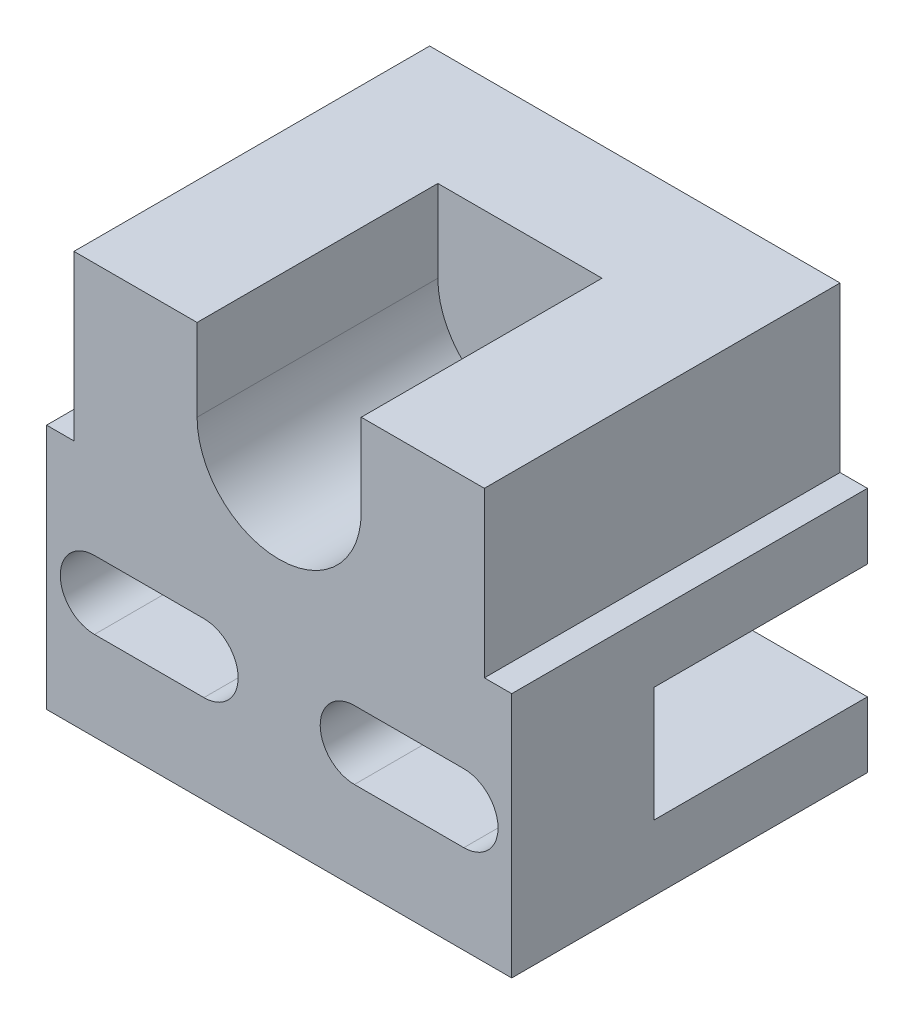
ISO-10303-21;
HEADER;
FILE_DESCRIPTION(('STEP AP214'),'2;1');
FILE_NAME('part.step','',(''),(''),'','','');
FILE_SCHEMA(('AUTOMOTIVE_DESIGN { 1 0 10303 214 1 1 1 1 }'));
ENDSEC;
DATA;
#1=APPLICATION_CONTEXT('core data for automotive mechanical design processes');
#2=APPLICATION_PROTOCOL_DEFINITION('international standard','automotive_design',2000,#1);
#3=PRODUCT_CONTEXT('',#1,'mechanical');
#4=PRODUCT('Part','Part','',(#3));
#5=PRODUCT_RELATED_PRODUCT_CATEGORY('part','',(#4));
#6=PRODUCT_DEFINITION_FORMATION('','',#4);
#7=PRODUCT_DEFINITION_CONTEXT('part definition',#1,'design');
#8=PRODUCT_DEFINITION('design','',#6,#7);
#9=PRODUCT_DEFINITION_SHAPE('','',#8);
#10=(LENGTH_UNIT() NAMED_UNIT(*) SI_UNIT(.MILLI.,.METRE.));
#11=(NAMED_UNIT(*) PLANE_ANGLE_UNIT() SI_UNIT($,.RADIAN.));
#12=(NAMED_UNIT(*) SI_UNIT($,.STERADIAN.) SOLID_ANGLE_UNIT());
#13=UNCERTAINTY_MEASURE_WITH_UNIT(LENGTH_MEASURE(1.E-05),#10,'distance_accuracy_value','');
#14=(GEOMETRIC_REPRESENTATION_CONTEXT(3) GLOBAL_UNCERTAINTY_ASSIGNED_CONTEXT((#13)) GLOBAL_UNIT_ASSIGNED_CONTEXT((#10,
#11,#12)) REPRESENTATION_CONTEXT('',''));
#15=CARTESIAN_POINT('',(0.,0.,0.));
#16=DIRECTION('',(0.,0.,1.));
#17=DIRECTION('',(1.,0.,0.));
#18=AXIS2_PLACEMENT_3D('',#15,#16,#17);
#19=CARTESIAN_POINT('',(0.,0.,0.));
#20=DIRECTION('',(0.,0.,1.));
#21=DIRECTION('',(1.,0.,0.));
#22=AXIS2_PLACEMENT_3D('',#19,#20,#21);
#23=PLANE('',#22);
#24=CARTESIAN_POINT('',(0.,8.26313972081442,0.));
#25=DIRECTION('',(0.,0.,1.));
#26=DIRECTION('',(1.,0.,0.));
#27=AXIS2_PLACEMENT_3D('',#24,#25,#26);
#28=CIRCLE('',#27,1.4);
#29=CARTESIAN_POINT('',(1.4,8.26313972081442,0.));
#30=VERTEX_POINT('',#29);
#31=EDGE_CURVE('E335',#30,#30,#28,.F.);
#32=ORIENTED_EDGE('',*,*,#31,.F.);
#33=EDGE_LOOP('',(#32));
#34=FACE_BOUND('',#33,.T.);
#35=CARTESIAN_POINT('',(0.,12.,0.));
#36=DIRECTION('',(0.,0.,1.));
#37=DIRECTION('',(1.,0.,0.));
#38=AXIS2_PLACEMENT_3D('',#35,#36,#37);
#39=CIRCLE('',#38,1.6);
#40=CARTESIAN_POINT('',(1.6,12.,0.));
#41=VERTEX_POINT('',#40);
#42=EDGE_CURVE('E535',#41,#41,#39,.T.);
#43=ORIENTED_EDGE('',*,*,#42,.T.);
#44=EDGE_LOOP('',(#43));
#45=FACE_BOUND('',#44,.T.);
#46=CARTESIAN_POINT('',(0.,2.26313972081442,0.));
#47=DIRECTION('',(0.,0.,-1.));
#48=DIRECTION('',(-1.,0.,0.));
#49=AXIS2_PLACEMENT_3D('',#46,#47,#48);
#50=CIRCLE('',#49,1.4);
#51=CARTESIAN_POINT('',(-1.21243556529821,2.96313972081442,0.));
#52=VERTEX_POINT('',#51);
#53=CARTESIAN_POINT('',(1.21243556529821,2.96313972081441,0.));
#54=VERTEX_POINT('',#53);
#55=EDGE_CURVE('E597',#52,#54,#50,.T.);
#56=ORIENTED_EDGE('',*,*,#55,.F.);
#57=DIRECTION('',(-0.5,-0.866025403784439,0.));
#58=VECTOR('',#57,1.);
#59=CARTESIAN_POINT('',(-0.325128869403573,4.5,0.));
#60=LINE('',#59,#58);
#61=CARTESIAN_POINT('',(-0.325128869403573,4.5,0.));
#62=VERTEX_POINT('',#61);
#63=EDGE_CURVE('E436',#62,#52,#60,.T.);
#64=ORIENTED_EDGE('',*,*,#63,.F.);
#65=DIRECTION('',(0.5,-0.866025403784439,0.));
#66=VECTOR('',#65,1.);
#67=CARTESIAN_POINT('',(-1.53756443470179,6.6,0.));
#68=LINE('',#67,#66);
#69=CARTESIAN_POINT('',(-1.53756443470179,6.6,0.));
#70=VERTEX_POINT('',#69);
#71=EDGE_CURVE('E439',#70,#62,#68,.T.);
#72=ORIENTED_EDGE('',*,*,#71,.F.);
#73=DIRECTION('',(1.,0.,0.));
#74=VECTOR('',#73,1.);
#75=CARTESIAN_POINT('',(-3.96243556529822,6.6,0.));
#76=LINE('',#75,#74);
#77=CARTESIAN_POINT('',(-8.5,6.6,0.));
#78=VERTEX_POINT('',#77);
#79=EDGE_CURVE('E432',#78,#70,#76,.T.);
#80=ORIENTED_EDGE('',*,*,#79,.F.);
#81=DIRECTION('',(0.,-1.,0.));
#82=VECTOR('',#81,1.);
#83=CARTESIAN_POINT('',(-8.5,0.,0.));
#84=LINE('',#83,#82);
#85=CARTESIAN_POINT('',(-8.5,9.,0.));
#86=VERTEX_POINT('',#85);
#87=EDGE_CURVE('E263',#86,#78,#84,.T.);
#88=ORIENTED_EDGE('',*,*,#87,.F.);
#89=DIRECTION('',(-1.,0.,0.));
#90=VECTOR('',#89,1.);
#91=CARTESIAN_POINT('',(-7.5,9.,0.));
#92=LINE('',#91,#90);
#93=CARTESIAN_POINT('',(-7.5,9.,0.));
#94=VERTEX_POINT('',#93);
#95=EDGE_CURVE('E273',#94,#86,#92,.T.);
#96=ORIENTED_EDGE('',*,*,#95,.F.);
#97=DIRECTION('',(0.,-1.,0.));
#98=VECTOR('',#97,1.);
#99=CARTESIAN_POINT('',(-7.5,15.,0.));
#100=LINE('',#99,#98);
#101=CARTESIAN_POINT('',(-7.5,15.,0.));
#102=VERTEX_POINT('',#101);
#103=EDGE_CURVE('E302',#102,#94,#100,.T.);
#104=ORIENTED_EDGE('',*,*,#103,.F.);
#105=DIRECTION('',(-1.,0.,0.));
#106=VECTOR('',#105,1.);
#107=CARTESIAN_POINT('',(-7.5,15.,0.));
#108=LINE('',#107,#106);
#109=CARTESIAN_POINT('',(7.5,15.,0.));
#110=VERTEX_POINT('',#109);
#111=EDGE_CURVE('E300',#110,#102,#108,.T.);
#112=ORIENTED_EDGE('',*,*,#111,.F.);
#113=DIRECTION('',(0.,1.,0.));
#114=VECTOR('',#113,1.);
#115=CARTESIAN_POINT('',(7.5,9.,0.));
#116=LINE('',#115,#114);
#117=CARTESIAN_POINT('',(7.5,9.,0.));
#118=VERTEX_POINT('',#117);
#119=EDGE_CURVE('E298',#118,#110,#116,.T.);
#120=ORIENTED_EDGE('',*,*,#119,.F.);
#121=DIRECTION('',(-1.,0.,0.));
#122=VECTOR('',#121,1.);
#123=CARTESIAN_POINT('',(8.5,9.,0.));
#124=LINE('',#123,#122);
#125=CARTESIAN_POINT('',(8.5,9.,0.));
#126=VERTEX_POINT('',#125);
#127=EDGE_CURVE('E296',#126,#118,#124,.T.);
#128=ORIENTED_EDGE('',*,*,#127,.F.);
#129=DIRECTION('',(0.,1.,0.));
#130=VECTOR('',#129,1.);
#131=CARTESIAN_POINT('',(8.5,0.,0.));
#132=LINE('',#131,#130);
#133=CARTESIAN_POINT('',(8.5,6.6,0.));
#134=VERTEX_POINT('',#133);
#135=EDGE_CURVE('E292',#134,#126,#132,.T.);
#136=ORIENTED_EDGE('',*,*,#135,.F.);
#137=DIRECTION('',(1.,0.,0.));
#138=VECTOR('',#137,1.);
#139=CARTESIAN_POINT('',(1.53756443470178,6.6,0.));
#140=LINE('',#139,#138);
#141=CARTESIAN_POINT('',(1.53756443470178,6.6,0.));
#142=VERTEX_POINT('',#141);
#143=EDGE_CURVE('E474',#142,#134,#140,.T.);
#144=ORIENTED_EDGE('',*,*,#143,.F.);
#145=DIRECTION('',(0.5,0.866025403784439,0.));
#146=VECTOR('',#145,1.);
#147=CARTESIAN_POINT('',(0.325128869403569,4.5,0.));
#148=LINE('',#147,#146);
#149=CARTESIAN_POINT('',(0.325128869403569,4.5,0.));
#150=VERTEX_POINT('',#149);
#151=EDGE_CURVE('E465',#150,#142,#148,.T.);
#152=ORIENTED_EDGE('',*,*,#151,.F.);
#153=DIRECTION('',(-0.5,0.866025403784439,0.));
#154=VECTOR('',#153,1.);
#155=CARTESIAN_POINT('',(1.53756443470178,2.4,0.));
#156=LINE('',#155,#154);
#157=EDGE_CURVE('E470',#54,#150,#156,.T.);
#158=ORIENTED_EDGE('',*,*,#157,.F.);
#159=EDGE_LOOP('',(#56,#64,#72,#80,#88,#96,#104,#112,#120,#128,#136,#144,#152,#158));
#160=FACE_BOUND('',#159,.T.);
#161=ADVANCED_FACE('F36',(#34,#45,#160),#23,.F.);
#162=EDGE_CURVE('E59',#54,#52,#50,.T.);
#163=ORIENTED_EDGE('',*,*,#162,.F.);
#164=CARTESIAN_POINT('',(1.53756443470178,2.4,0.));
#165=VERTEX_POINT('',#164);
#166=EDGE_CURVE('E466',#165,#54,#156,.T.);
#167=ORIENTED_EDGE('',*,*,#166,.F.);
#168=DIRECTION('',(-1.,0.,0.));
#169=VECTOR('',#168,1.);
#170=CARTESIAN_POINT('',(3.96243556529821,2.4,0.));
#171=LINE('',#170,#169);
#172=CARTESIAN_POINT('',(8.5,2.4,0.));
#173=VERTEX_POINT('',#172);
#174=EDGE_CURVE('E471',#173,#165,#171,.T.);
#175=ORIENTED_EDGE('',*,*,#174,.F.);
#176=CARTESIAN_POINT('',(8.5,0.,0.));
#177=VERTEX_POINT('',#176);
#178=EDGE_CURVE('E293',#177,#173,#132,.T.);
#179=ORIENTED_EDGE('',*,*,#178,.F.);
#180=DIRECTION('',(1.,0.,0.));
#181=VECTOR('',#180,1.);
#182=CARTESIAN_POINT('',(-8.5,0.,0.));
#183=LINE('',#182,#181);
#184=CARTESIAN_POINT('',(-8.5,0.,0.));
#185=VERTEX_POINT('',#184);
#186=EDGE_CURVE('E290',#185,#177,#183,.T.);
#187=ORIENTED_EDGE('',*,*,#186,.F.);
#188=CARTESIAN_POINT('',(-8.50000000000001,2.4,0.));
#189=VERTEX_POINT('',#188);
#190=EDGE_CURVE('E261',#189,#185,#84,.T.);
#191=ORIENTED_EDGE('',*,*,#190,.F.);
#192=DIRECTION('',(-1.,0.,0.));
#193=VECTOR('',#192,1.);
#194=CARTESIAN_POINT('',(-1.53756443470179,2.4,0.));
#195=LINE('',#194,#193);
#196=CARTESIAN_POINT('',(-1.53756443470179,2.4,0.));
#197=VERTEX_POINT('',#196);
#198=EDGE_CURVE('E433',#197,#189,#195,.T.);
#199=ORIENTED_EDGE('',*,*,#198,.F.);
#200=EDGE_CURVE('E438',#52,#197,#60,.T.);
#201=ORIENTED_EDGE('',*,*,#200,.F.);
#202=EDGE_LOOP('',(#163,#167,#175,#179,#187,#191,#199,#201));
#203=FACE_BOUND('',#202,.T.);
#204=ADVANCED_FACE('F362',(#203),#23,.F.);
#205=CARTESIAN_POINT('',(8.5,0.,13.));
#206=DIRECTION('',(-1.,0.,0.));
#207=DIRECTION('',(0.,-1.,0.));
#208=AXIS2_PLACEMENT_3D('',#205,#206,#207);
#209=PLANE('',#208);
#210=DIRECTION('',(0.,0.,1.));
#211=VECTOR('',#210,1.);
#212=CARTESIAN_POINT('',(8.5,2.4,-8.13114438445964));
#213=LINE('',#212,#211);
#214=CARTESIAN_POINT('',(8.5,2.4,7.8));
#215=VERTEX_POINT('',#214);
#216=EDGE_CURVE('E591',#173,#215,#213,.T.);
#217=ORIENTED_EDGE('',*,*,#216,.T.);
#218=DIRECTION('',(0.,-1.,0.));
#219=VECTOR('',#218,1.);
#220=CARTESIAN_POINT('',(8.5,6.6,7.8));
#221=LINE('',#220,#219);
#222=CARTESIAN_POINT('',(8.5,6.6,7.8));
#223=VERTEX_POINT('',#222);
#224=EDGE_CURVE('E589',#223,#215,#221,.T.);
#225=ORIENTED_EDGE('',*,*,#224,.F.);
#226=DIRECTION('',(0.,0.,1.));
#227=VECTOR('',#226,1.);
#228=CARTESIAN_POINT('',(8.5,6.6,-8.13114438445964));
#229=LINE('',#228,#227);
#230=EDGE_CURVE('E587',#134,#223,#229,.T.);
#231=ORIENTED_EDGE('',*,*,#230,.F.);
#232=ORIENTED_EDGE('',*,*,#135,.T.);
#233=DIRECTION('',(0.,0.,-1.));
#234=VECTOR('',#233,1.);
#235=CARTESIAN_POINT('',(8.5,9.,13.));
#236=LINE('',#235,#234);
#237=CARTESIAN_POINT('',(8.5,9.,13.));
#238=VERTEX_POINT('',#237);
#239=EDGE_CURVE('E319',#238,#126,#236,.T.);
#240=ORIENTED_EDGE('',*,*,#239,.F.);
#241=DIRECTION('',(0.,1.,0.));
#242=VECTOR('',#241,1.);
#243=CARTESIAN_POINT('',(8.5,0.,13.));
#244=LINE('',#243,#242);
#245=CARTESIAN_POINT('',(8.5,0.,13.));
#246=VERTEX_POINT('',#245);
#247=EDGE_CURVE('E275',#246,#238,#244,.T.);
#248=ORIENTED_EDGE('',*,*,#247,.F.);
#249=DIRECTION('',(0.,0.,-1.));
#250=VECTOR('',#249,1.);
#251=CARTESIAN_POINT('',(8.5,0.,13.));
#252=LINE('',#251,#250);
#253=EDGE_CURVE('E322',#246,#177,#252,.T.);
#254=ORIENTED_EDGE('',*,*,#253,.T.);
#255=ORIENTED_EDGE('',*,*,#178,.T.);
#256=EDGE_LOOP('',(#217,#225,#231,#232,#240,#248,#254,#255));
#257=FACE_BOUND('',#256,.T.);
#258=ADVANCED_FACE('F368',(#257),#209,.F.);
#259=CARTESIAN_POINT('',(-8.5,0.,13.));
#260=DIRECTION('',(1.,0.,0.));
#261=DIRECTION('',(0.,1.,0.));
#262=AXIS2_PLACEMENT_3D('',#259,#260,#261);
#263=PLANE('',#262);
#264=DIRECTION('',(0.,0.,1.));
#265=VECTOR('',#264,1.);
#266=CARTESIAN_POINT('',(-8.5,6.6,-8.13114438445964));
#267=LINE('',#266,#265);
#268=CARTESIAN_POINT('',(-8.5,6.6,7.8));
#269=VERTEX_POINT('',#268);
#270=EDGE_CURVE('E414',#78,#269,#267,.T.);
#271=ORIENTED_EDGE('',*,*,#270,.T.);
#272=DIRECTION('',(0.,1.,0.));
#273=VECTOR('',#272,1.);
#274=CARTESIAN_POINT('',(-8.5,6.6,7.8));
#275=LINE('',#274,#273);
#276=CARTESIAN_POINT('',(-8.50000000000001,2.4,7.8));
#277=VERTEX_POINT('',#276);
#278=EDGE_CURVE('E417',#277,#269,#275,.T.);
#279=ORIENTED_EDGE('',*,*,#278,.F.);
#280=DIRECTION('',(0.,0.,1.));
#281=VECTOR('',#280,1.);
#282=CARTESIAN_POINT('',(-8.50000000000001,2.4,-8.13114438445964));
#283=LINE('',#282,#281);
#284=EDGE_CURVE('E421',#189,#277,#283,.T.);
#285=ORIENTED_EDGE('',*,*,#284,.F.);
#286=ORIENTED_EDGE('',*,*,#190,.T.);
#287=DIRECTION('',(0.,0.,-1.));
#288=VECTOR('',#287,1.);
#289=CARTESIAN_POINT('',(-8.5,0.,13.));
#290=LINE('',#289,#288);
#291=CARTESIAN_POINT('',(-8.5,0.,13.));
#292=VERTEX_POINT('',#291);
#293=EDGE_CURVE('E325',#292,#185,#290,.T.);
#294=ORIENTED_EDGE('',*,*,#293,.F.);
#295=DIRECTION('',(0.,-1.,0.));
#296=VECTOR('',#295,1.);
#297=CARTESIAN_POINT('',(-8.5,0.,13.));
#298=LINE('',#297,#296);
#299=CARTESIAN_POINT('',(-8.5,9.,13.));
#300=VERTEX_POINT('',#299);
#301=EDGE_CURVE('E269',#300,#292,#298,.T.);
#302=ORIENTED_EDGE('',*,*,#301,.F.);
#303=DIRECTION('',(0.,0.,-1.));
#304=VECTOR('',#303,1.);
#305=CARTESIAN_POINT('',(-8.5,9.,13.));
#306=LINE('',#305,#304);
#307=EDGE_CURVE('E287',#300,#86,#306,.T.);
#308=ORIENTED_EDGE('',*,*,#307,.T.);
#309=ORIENTED_EDGE('',*,*,#87,.T.);
#310=EDGE_LOOP('',(#271,#279,#285,#286,#294,#302,#308,#309));
#311=FACE_BOUND('',#310,.T.);
#312=ADVANCED_FACE('F396',(#311),#263,.F.);
#313=CARTESIAN_POINT('',(-6.75,5.75,0.));
#314=DIRECTION('',(0.,1.,0.));
#315=DIRECTION('',(-1.,0.,0.));
#316=AXIS2_PLACEMENT_3D('',#313,#314,#315);
#317=PLANE('',#316);
#318=DIRECTION('',(0.,0.,1.));
#319=VECTOR('',#318,1.);
#320=CARTESIAN_POINT('',(-6.75,5.75,0.));
#321=LINE('',#320,#319);
#322=CARTESIAN_POINT('',(-6.75,5.75,7.8));
#323=VERTEX_POINT('',#322);
#324=CARTESIAN_POINT('',(-6.75,5.75,13.));
#325=VERTEX_POINT('',#324);
#326=EDGE_CURVE('E533',#323,#325,#321,.T.);
#327=ORIENTED_EDGE('',*,*,#326,.F.);
#328=DIRECTION('',(1.,0.,0.));
#329=VECTOR('',#328,1.);
#330=CARTESIAN_POINT('',(-6.75,5.75,7.8));
#331=LINE('',#330,#329);
#332=CARTESIAN_POINT('',(-2.75,5.75,7.8));
#333=VERTEX_POINT('',#332);
#334=EDGE_CURVE('E462',#323,#333,#331,.T.);
#335=ORIENTED_EDGE('',*,*,#334,.T.);
#336=DIRECTION('',(0.,0.,1.));
#337=VECTOR('',#336,1.);
#338=CARTESIAN_POINT('',(-2.75,5.75,0.));
#339=LINE('',#338,#337);
#340=CARTESIAN_POINT('',(-2.75,5.75,13.));
#341=VERTEX_POINT('',#340);
#342=EDGE_CURVE('E536',#333,#341,#339,.T.);
#343=ORIENTED_EDGE('',*,*,#342,.T.);
#344=DIRECTION('',(-1.,0.,0.));
#345=VECTOR('',#344,1.);
#346=CARTESIAN_POINT('',(-6.75,5.75,13.));
#347=LINE('',#346,#345);
#348=EDGE_CURVE('E529',#341,#325,#347,.T.);
#349=ORIENTED_EDGE('',*,*,#348,.T.);
#350=EDGE_LOOP('',(#327,#335,#343,#349));
#351=FACE_BOUND('',#350,.T.);
#352=ADVANCED_FACE('F403',(#351),#317,.F.);
#353=CARTESIAN_POINT('',(-6.75,3.25,0.));
#354=DIRECTION('',(0.,-1.,0.));
#355=DIRECTION('',(1.,0.,0.));
#356=AXIS2_PLACEMENT_3D('',#353,#354,#355);
#357=PLANE('',#356);
#358=DIRECTION('',(-1.,0.,0.));
#359=VECTOR('',#358,1.);
#360=CARTESIAN_POINT('',(-6.75,3.25,7.8));
#361=LINE('',#360,#359);
#362=CARTESIAN_POINT('',(-2.75,3.25,7.8));
#363=VERTEX_POINT('',#362);
#364=CARTESIAN_POINT('',(-6.75,3.25,7.8));
#365=VERTEX_POINT('',#364);
#366=EDGE_CURVE('E460',#363,#365,#361,.T.);
#367=ORIENTED_EDGE('',*,*,#366,.T.);
#368=DIRECTION('',(0.,0.,1.));
#369=VECTOR('',#368,1.);
#370=CARTESIAN_POINT('',(-6.75,3.25,0.));
#371=LINE('',#370,#369);
#372=CARTESIAN_POINT('',(-6.75,3.25,13.));
#373=VERTEX_POINT('',#372);
#374=EDGE_CURVE('E532',#365,#373,#371,.T.);
#375=ORIENTED_EDGE('',*,*,#374,.T.);
#376=DIRECTION('',(1.,0.,0.));
#377=VECTOR('',#376,1.);
#378=CARTESIAN_POINT('',(-6.75,3.25,13.));
#379=LINE('',#378,#377);
#380=CARTESIAN_POINT('',(-2.75,3.25,13.));
#381=VERTEX_POINT('',#380);
#382=EDGE_CURVE('E523',#373,#381,#379,.T.);
#383=ORIENTED_EDGE('',*,*,#382,.T.);
#384=DIRECTION('',(0.,0.,1.));
#385=VECTOR('',#384,1.);
#386=CARTESIAN_POINT('',(-2.75,3.25,0.));
#387=LINE('',#386,#385);
#388=EDGE_CURVE('E538',#363,#381,#387,.T.);
#389=ORIENTED_EDGE('',*,*,#388,.F.);
#390=EDGE_LOOP('',(#367,#375,#383,#389));
#391=FACE_BOUND('',#390,.T.);
#392=ADVANCED_FACE('F408',(#391),#357,.F.);
#393=CARTESIAN_POINT('',(-6.75,4.5,0.));
#394=DIRECTION('',(0.,0.,1.));
#395=DIRECTION('',(1.,0.,0.));
#396=AXIS2_PLACEMENT_3D('',#393,#394,#395);
#397=CYLINDRICAL_SURFACE('',#396,1.25);
#398=CARTESIAN_POINT('',(-6.75,4.5,7.8));
#399=DIRECTION('',(0.,0.,-1.));
#400=DIRECTION('',(-1.,0.,0.));
#401=AXIS2_PLACEMENT_3D('',#398,#399,#400);
#402=CIRCLE('',#401,1.25);
#403=EDGE_CURVE('E424',#323,#365,#402,.F.);
#404=ORIENTED_EDGE('',*,*,#403,.F.);
#405=ORIENTED_EDGE('',*,*,#326,.T.);
#406=CARTESIAN_POINT('',(-6.75,4.5,13.));
#407=DIRECTION('',(0.,0.,1.));
#408=DIRECTION('',(1.,0.,0.));
#409=AXIS2_PLACEMENT_3D('',#406,#407,#408);
#410=CIRCLE('',#409,1.25);
#411=EDGE_CURVE('E515',#325,#373,#410,.T.);
#412=ORIENTED_EDGE('',*,*,#411,.T.);
#413=ORIENTED_EDGE('',*,*,#374,.F.);
#414=EDGE_LOOP('',(#404,#405,#412,#413));
#415=FACE_BOUND('',#414,.T.);
#416=ADVANCED_FACE('F400',(#415),#397,.F.);
#417=CARTESIAN_POINT('',(-8.5,0.,13.));
#418=DIRECTION('',(0.,1.,0.));
#419=DIRECTION('',(0.,0.,1.));
#420=AXIS2_PLACEMENT_3D('',#417,#418,#419);
#421=PLANE('',#420);
#422=ORIENTED_EDGE('',*,*,#186,.T.);
#423=ORIENTED_EDGE('',*,*,#253,.F.);
#424=DIRECTION('',(1.,0.,0.));
#425=VECTOR('',#424,1.);
#426=CARTESIAN_POINT('',(-8.5,0.,13.));
#427=LINE('',#426,#425);
#428=EDGE_CURVE('E272',#292,#246,#427,.T.);
#429=ORIENTED_EDGE('',*,*,#428,.F.);
#430=ORIENTED_EDGE('',*,*,#293,.T.);
#431=EDGE_LOOP('',(#422,#423,#429,#430));
#432=FACE_BOUND('',#431,.T.);
#433=ADVANCED_FACE('F392',(#432),#421,.F.);
#434=CARTESIAN_POINT('',(8.5,9.,13.));
#435=DIRECTION('',(0.,-1.,0.));
#436=DIRECTION('',(0.,0.,-1.));
#437=AXIS2_PLACEMENT_3D('',#434,#435,#436);
#438=PLANE('',#437);
#439=ORIENTED_EDGE('',*,*,#127,.T.);
#440=DIRECTION('',(0.,0.,-1.));
#441=VECTOR('',#440,1.);
#442=CARTESIAN_POINT('',(7.5,9.,13.));
#443=LINE('',#442,#441);
#444=CARTESIAN_POINT('',(7.5,9.,13.));
#445=VERTEX_POINT('',#444);
#446=EDGE_CURVE('E316',#445,#118,#443,.T.);
#447=ORIENTED_EDGE('',*,*,#446,.F.);
#448=DIRECTION('',(-1.,0.,0.));
#449=VECTOR('',#448,1.);
#450=CARTESIAN_POINT('',(8.5,9.,13.));
#451=LINE('',#450,#449);
#452=EDGE_CURVE('E277',#238,#445,#451,.T.);
#453=ORIENTED_EDGE('',*,*,#452,.F.);
#454=ORIENTED_EDGE('',*,*,#239,.T.);
#455=EDGE_LOOP('',(#439,#447,#453,#454));
#456=FACE_BOUND('',#455,.T.);
#457=ADVANCED_FACE('F388',(#456),#438,.F.);
#458=CARTESIAN_POINT('',(7.5,9.,13.));
#459=DIRECTION('',(-1.,0.,0.));
#460=DIRECTION('',(0.,-1.,0.));
#461=AXIS2_PLACEMENT_3D('',#458,#459,#460);
#462=PLANE('',#461);
#463=ORIENTED_EDGE('',*,*,#119,.T.);
#464=DIRECTION('',(0.,0.,-1.));
#465=VECTOR('',#464,1.);
#466=CARTESIAN_POINT('',(7.5,15.,13.));
#467=LINE('',#466,#465);
#468=CARTESIAN_POINT('',(7.5,15.,13.));
#469=VERTEX_POINT('',#468);
#470=EDGE_CURVE('E313',#469,#110,#467,.T.);
#471=ORIENTED_EDGE('',*,*,#470,.F.);
#472=DIRECTION('',(0.,1.,0.));
#473=VECTOR('',#472,1.);
#474=CARTESIAN_POINT('',(7.5,9.,13.));
#475=LINE('',#474,#473);
#476=EDGE_CURVE('E279',#445,#469,#475,.T.);
#477=ORIENTED_EDGE('',*,*,#476,.F.);
#478=ORIENTED_EDGE('',*,*,#446,.T.);
#479=EDGE_LOOP('',(#463,#471,#477,#478));
#480=FACE_BOUND('',#479,.T.);
#481=ADVANCED_FACE('F385',(#480),#462,.F.);
#482=CARTESIAN_POINT('',(-7.5,15.,13.));
#483=DIRECTION('',(0.,-1.,0.));
#484=DIRECTION('',(0.,0.,-1.));
#485=AXIS2_PLACEMENT_3D('',#482,#483,#484);
#486=PLANE('',#485);
#487=DIRECTION('',(-1.,0.,0.));
#488=VECTOR('',#487,1.);
#489=CARTESIAN_POINT('',(3.,15.,4.2));
#490=LINE('',#489,#488);
#491=CARTESIAN_POINT('',(3.,15.,4.2));
#492=VERTEX_POINT('',#491);
#493=CARTESIAN_POINT('',(-3.,15.,4.2));
#494=VERTEX_POINT('',#493);
#495=EDGE_CURVE('E240',#492,#494,#490,.T.);
#496=ORIENTED_EDGE('',*,*,#495,.F.);
#497=DIRECTION('',(0.,0.,1.));
#498=VECTOR('',#497,1.);
#499=CARTESIAN_POINT('',(3.,15.,13.));
#500=LINE('',#499,#498);
#501=CARTESIAN_POINT('',(3.,15.,13.));
#502=VERTEX_POINT('',#501);
#503=EDGE_CURVE('E245',#492,#502,#500,.T.);
#504=ORIENTED_EDGE('',*,*,#503,.T.);
#505=DIRECTION('',(-1.,0.,0.));
#506=VECTOR('',#505,1.);
#507=CARTESIAN_POINT('',(-7.5,15.,13.));
#508=LINE('',#507,#506);
#509=EDGE_CURVE('E282',#469,#502,#508,.T.);
#510=ORIENTED_EDGE('',*,*,#509,.F.);
#511=ORIENTED_EDGE('',*,*,#470,.T.);
#512=ORIENTED_EDGE('',*,*,#111,.T.);
#513=DIRECTION('',(0.,0.,-1.));
#514=VECTOR('',#513,1.);
#515=CARTESIAN_POINT('',(-7.5,15.,13.));
#516=LINE('',#515,#514);
#517=CARTESIAN_POINT('',(-7.5,15.,13.));
#518=VERTEX_POINT('',#517);
#519=EDGE_CURVE('E310',#518,#102,#516,.T.);
#520=ORIENTED_EDGE('',*,*,#519,.F.);
#521=CARTESIAN_POINT('',(-3.,15.,13.));
#522=VERTEX_POINT('',#521);
#523=EDGE_CURVE('E281',#522,#518,#508,.T.);
#524=ORIENTED_EDGE('',*,*,#523,.F.);
#525=DIRECTION('',(0.,0.,-1.));
#526=VECTOR('',#525,1.);
#527=CARTESIAN_POINT('',(-3.,15.,13.));
#528=LINE('',#527,#526);
#529=EDGE_CURVE('E248',#522,#494,#528,.T.);
#530=ORIENTED_EDGE('',*,*,#529,.T.);
#531=EDGE_LOOP('',(#496,#504,#510,#511,#512,#520,#524,#530));
#532=FACE_BOUND('',#531,.T.);
#533=ADVANCED_FACE('F242',(#532),#486,.F.);
#534=CARTESIAN_POINT('',(-7.5,15.,13.));
#535=DIRECTION('',(1.,0.,0.));
#536=DIRECTION('',(0.,1.,0.));
#537=AXIS2_PLACEMENT_3D('',#534,#535,#536);
#538=PLANE('',#537);
#539=ORIENTED_EDGE('',*,*,#103,.T.);
#540=DIRECTION('',(0.,0.,-1.));
#541=VECTOR('',#540,1.);
#542=CARTESIAN_POINT('',(-7.5,9.,13.));
#543=LINE('',#542,#541);
#544=CARTESIAN_POINT('',(-7.5,9.,13.));
#545=VERTEX_POINT('',#544);
#546=EDGE_CURVE('E307',#545,#94,#543,.T.);
#547=ORIENTED_EDGE('',*,*,#546,.F.);
#548=DIRECTION('',(0.,-1.,0.));
#549=VECTOR('',#548,1.);
#550=CARTESIAN_POINT('',(-7.5,15.,13.));
#551=LINE('',#550,#549);
#552=EDGE_CURVE('E284',#518,#545,#551,.T.);
#553=ORIENTED_EDGE('',*,*,#552,.F.);
#554=ORIENTED_EDGE('',*,*,#519,.T.);
#555=EDGE_LOOP('',(#539,#547,#553,#554));
#556=FACE_BOUND('',#555,.T.);
#557=ADVANCED_FACE('F378',(#556),#538,.F.);
#558=CARTESIAN_POINT('',(-7.5,9.,13.));
#559=DIRECTION('',(0.,-1.,0.));
#560=DIRECTION('',(0.,0.,-1.));
#561=AXIS2_PLACEMENT_3D('',#558,#559,#560);
#562=PLANE('',#561);
#563=ORIENTED_EDGE('',*,*,#95,.T.);
#564=ORIENTED_EDGE('',*,*,#307,.F.);
#565=DIRECTION('',(-1.,0.,0.));
#566=VECTOR('',#565,1.);
#567=CARTESIAN_POINT('',(-7.5,9.,13.));
#568=LINE('',#567,#566);
#569=EDGE_CURVE('E286',#545,#300,#568,.T.);
#570=ORIENTED_EDGE('',*,*,#569,.F.);
#571=ORIENTED_EDGE('',*,*,#546,.T.);
#572=EDGE_LOOP('',(#563,#564,#570,#571));
#573=FACE_BOUND('',#572,.T.);
#574=ADVANCED_FACE('F375',(#573),#562,.F.);
#575=CARTESIAN_POINT('',(0.,0.,13.));
#576=DIRECTION('',(0.,0.,1.));
#577=DIRECTION('',(1.,0.,0.));
#578=AXIS2_PLACEMENT_3D('',#575,#576,#577);
#579=PLANE('',#578);
#580=CARTESIAN_POINT('',(6.75,4.5,13.));
#581=DIRECTION('',(0.,0.,1.));
#582=DIRECTION('',(1.,0.,0.));
#583=AXIS2_PLACEMENT_3D('',#580,#581,#582);
#584=CIRCLE('',#583,1.25);
#585=CARTESIAN_POINT('',(6.75,3.25,13.));
#586=VERTEX_POINT('',#585);
#587=CARTESIAN_POINT('',(6.75,5.75,13.));
#588=VERTEX_POINT('',#587);
#589=EDGE_CURVE('E500',#586,#588,#584,.T.);
#590=ORIENTED_EDGE('',*,*,#589,.F.);
#591=DIRECTION('',(1.,0.,0.));
#592=VECTOR('',#591,1.);
#593=CARTESIAN_POINT('',(6.75,3.25,13.));
#594=LINE('',#593,#592);
#595=CARTESIAN_POINT('',(2.75,3.25,13.));
#596=VERTEX_POINT('',#595);
#597=EDGE_CURVE('E509',#596,#586,#594,.T.);
#598=ORIENTED_EDGE('',*,*,#597,.F.);
#599=CARTESIAN_POINT('',(2.75,4.5,13.));
#600=DIRECTION('',(0.,0.,1.));
#601=DIRECTION('',(1.,0.,0.));
#602=AXIS2_PLACEMENT_3D('',#599,#600,#601);
#603=CIRCLE('',#602,1.25);
#604=CARTESIAN_POINT('',(2.75,5.75,13.));
#605=VERTEX_POINT('',#604);
#606=EDGE_CURVE('E506',#605,#596,#603,.T.);
#607=ORIENTED_EDGE('',*,*,#606,.F.);
#608=DIRECTION('',(-1.,0.,0.));
#609=VECTOR('',#608,1.);
#610=CARTESIAN_POINT('',(6.75,5.75,13.));
#611=LINE('',#610,#609);
#612=EDGE_CURVE('E503',#588,#605,#611,.T.);
#613=ORIENTED_EDGE('',*,*,#612,.F.);
#614=EDGE_LOOP('',(#590,#598,#607,#613));
#615=FACE_BOUND('',#614,.T.);
#616=ORIENTED_EDGE('',*,*,#348,.F.);
#617=CARTESIAN_POINT('',(-2.75,4.5,13.));
#618=DIRECTION('',(0.,0.,1.));
#619=DIRECTION('',(1.,0.,0.));
#620=AXIS2_PLACEMENT_3D('',#617,#618,#619);
#621=CIRCLE('',#620,1.25);
#622=EDGE_CURVE('E526',#381,#341,#621,.T.);
#623=ORIENTED_EDGE('',*,*,#622,.F.);
#624=ORIENTED_EDGE('',*,*,#382,.F.);
#625=ORIENTED_EDGE('',*,*,#411,.F.);
#626=EDGE_LOOP('',(#616,#623,#624,#625));
#627=FACE_BOUND('',#626,.T.);
#628=DIRECTION('',(0.,1.,0.));
#629=VECTOR('',#628,1.);
#630=CARTESIAN_POINT('',(3.,18.,13.));
#631=LINE('',#630,#629);
#632=CARTESIAN_POINT('',(3.,12.,13.));
#633=VERTEX_POINT('',#632);
#634=EDGE_CURVE('E259',#633,#502,#631,.T.);
#635=ORIENTED_EDGE('',*,*,#634,.F.);
#636=CARTESIAN_POINT('',(0.,12.,13.));
#637=DIRECTION('',(0.,0.,1.));
#638=DIRECTION('',(1.,0.,0.));
#639=AXIS2_PLACEMENT_3D('',#636,#637,#638);
#640=CIRCLE('',#639,3.);
#641=CARTESIAN_POINT('',(-3.,12.,13.));
#642=VERTEX_POINT('',#641);
#643=EDGE_CURVE('E543',#642,#633,#640,.T.);
#644=ORIENTED_EDGE('',*,*,#643,.F.);
#645=DIRECTION('',(0.,-1.,0.));
#646=VECTOR('',#645,1.);
#647=CARTESIAN_POINT('',(-3.,0.,13.));
#648=LINE('',#647,#646);
#649=EDGE_CURVE('E328',#522,#642,#648,.T.);
#650=ORIENTED_EDGE('',*,*,#649,.F.);
#651=ORIENTED_EDGE('',*,*,#523,.T.);
#652=ORIENTED_EDGE('',*,*,#552,.T.);
#653=ORIENTED_EDGE('',*,*,#569,.T.);
#654=ORIENTED_EDGE('',*,*,#301,.T.);
#655=ORIENTED_EDGE('',*,*,#428,.T.);
#656=ORIENTED_EDGE('',*,*,#247,.T.);
#657=ORIENTED_EDGE('',*,*,#452,.T.);
#658=ORIENTED_EDGE('',*,*,#476,.T.);
#659=ORIENTED_EDGE('',*,*,#509,.T.);
#660=EDGE_LOOP('',(#635,#644,#650,#651,#652,#653,#654,#655,#656,#657,#658,#659));
#661=FACE_BOUND('',#660,.T.);
#662=ADVANCED_FACE('F373',(#615,#627,#661),#579,.T.);
#663=CARTESIAN_POINT('',(3.,18.,-13.4164078649987));
#664=DIRECTION('',(1.,0.,0.));
#665=DIRECTION('',(0.,1.,0.));
#666=AXIS2_PLACEMENT_3D('',#663,#664,#665);
#667=PLANE('',#666);
#668=ORIENTED_EDGE('',*,*,#503,.F.);
#669=DIRECTION('',(0.,1.,0.));
#670=VECTOR('',#669,1.);
#671=CARTESIAN_POINT('',(3.,12.,4.2));
#672=LINE('',#671,#670);
#673=CARTESIAN_POINT('',(3.,12.,4.2));
#674=VERTEX_POINT('',#673);
#675=EDGE_CURVE('E249',#674,#492,#672,.T.);
#676=ORIENTED_EDGE('',*,*,#675,.F.);
#677=DIRECTION('',(0.,0.,1.));
#678=VECTOR('',#677,1.);
#679=CARTESIAN_POINT('',(3.,12.,-13.4164078649987));
#680=LINE('',#679,#678);
#681=EDGE_CURVE('E265',#674,#633,#680,.T.);
#682=ORIENTED_EDGE('',*,*,#681,.T.);
#683=ORIENTED_EDGE('',*,*,#634,.T.);
#684=EDGE_LOOP('',(#668,#676,#682,#683));
#685=FACE_BOUND('',#684,.T.);
#686=ADVANCED_FACE('F257',(#685),#667,.F.);
#687=CARTESIAN_POINT('',(-3.,18.,-13.4164078649987));
#688=DIRECTION('',(-1.,0.,0.));
#689=DIRECTION('',(0.,-1.,0.));
#690=AXIS2_PLACEMENT_3D('',#687,#688,#689);
#691=PLANE('',#690);
#692=DIRECTION('',(0.,0.,1.));
#693=VECTOR('',#692,1.);
#694=CARTESIAN_POINT('',(-3.,12.,-13.4164078649987));
#695=LINE('',#694,#693);
#696=CARTESIAN_POINT('',(-3.,12.,4.2));
#697=VERTEX_POINT('',#696);
#698=EDGE_CURVE('E547',#697,#642,#695,.T.);
#699=ORIENTED_EDGE('',*,*,#698,.F.);
#700=DIRECTION('',(0.,-1.,0.));
#701=VECTOR('',#700,1.);
#702=CARTESIAN_POINT('',(-3.,15.,4.2));
#703=LINE('',#702,#701);
#704=EDGE_CURVE('E51',#494,#697,#703,.T.);
#705=ORIENTED_EDGE('',*,*,#704,.F.);
#706=ORIENTED_EDGE('',*,*,#529,.F.);
#707=ORIENTED_EDGE('',*,*,#649,.T.);
#708=EDGE_LOOP('',(#699,#705,#706,#707));
#709=FACE_BOUND('',#708,.T.);
#710=ADVANCED_FACE('F554',(#709),#691,.F.);
#711=CARTESIAN_POINT('',(0.,12.,-13.4164078649987));
#712=DIRECTION('',(0.,0.,1.));
#713=DIRECTION('',(1.,0.,0.));
#714=AXIS2_PLACEMENT_3D('',#711,#712,#713);
#715=CYLINDRICAL_SURFACE('',#714,3.);
#716=ORIENTED_EDGE('',*,*,#681,.F.);
#717=CARTESIAN_POINT('',(0.,12.,4.2));
#718=DIRECTION('',(0.,0.,1.));
#719=DIRECTION('',(1.,0.,0.));
#720=AXIS2_PLACEMENT_3D('',#717,#718,#719);
#721=CIRCLE('',#720,3.);
#722=EDGE_CURVE('E253',#697,#674,#721,.T.);
#723=ORIENTED_EDGE('',*,*,#722,.F.);
#724=ORIENTED_EDGE('',*,*,#698,.T.);
#725=ORIENTED_EDGE('',*,*,#643,.T.);
#726=EDGE_LOOP('',(#716,#723,#724,#725));
#727=FACE_BOUND('',#726,.T.);
#728=ADVANCED_FACE('F550',(#727),#715,.F.);
#729=CARTESIAN_POINT('',(0.,12.,0.));
#730=DIRECTION('',(0.,0.,1.));
#731=DIRECTION('',(1.,0.,0.));
#732=AXIS2_PLACEMENT_3D('',#729,#730,#731);
#733=CYLINDRICAL_SURFACE('',#732,1.6);
#734=ORIENTED_EDGE('',*,*,#42,.F.);
#735=EDGE_LOOP('',(#734));
#736=FACE_BOUND('',#735,.T.);
#737=CARTESIAN_POINT('',(0.,12.,4.));
#738=DIRECTION('',(0.,0.,1.));
#739=DIRECTION('',(1.,0.,0.));
#740=AXIS2_PLACEMENT_3D('',#737,#738,#739);
#741=CIRCLE('',#740,1.6);
#742=CARTESIAN_POINT('',(1.6,12.,4.));
#743=VERTEX_POINT('',#742);
#744=EDGE_CURVE('E600',#743,#743,#741,.F.);
#745=ORIENTED_EDGE('',*,*,#744,.F.);
#746=EDGE_LOOP('',(#745));
#747=FACE_BOUND('',#746,.T.);
#748=ADVANCED_FACE('F661',(#736,#747),#733,.F.);
#749=CARTESIAN_POINT('',(-2.75,4.5,0.));
#750=DIRECTION('',(0.,0.,1.));
#751=DIRECTION('',(1.,0.,0.));
#752=AXIS2_PLACEMENT_3D('',#749,#750,#751);
#753=CYLINDRICAL_SURFACE('',#752,1.25);
#754=ORIENTED_EDGE('',*,*,#342,.F.);
#755=CARTESIAN_POINT('',(-2.75,4.5,7.8));
#756=DIRECTION('',(0.,0.,1.));
#757=DIRECTION('',(1.,0.,0.));
#758=AXIS2_PLACEMENT_3D('',#755,#756,#757);
#759=CIRCLE('',#758,1.25);
#760=EDGE_CURVE('E333',#333,#363,#759,.F.);
#761=ORIENTED_EDGE('',*,*,#760,.T.);
#762=ORIENTED_EDGE('',*,*,#388,.T.);
#763=ORIENTED_EDGE('',*,*,#622,.T.);
#764=EDGE_LOOP('',(#754,#761,#762,#763));
#765=FACE_BOUND('',#764,.T.);
#766=ADVANCED_FACE('F647',(#765),#753,.F.);
#767=CARTESIAN_POINT('',(6.75,3.25,0.));
#768=DIRECTION('',(0.,-1.,0.));
#769=DIRECTION('',(1.,0.,0.));
#770=AXIS2_PLACEMENT_3D('',#767,#768,#769);
#771=PLANE('',#770);
#772=DIRECTION('',(0.,0.,1.));
#773=VECTOR('',#772,1.);
#774=CARTESIAN_POINT('',(6.75,3.25,0.));
#775=LINE('',#774,#773);
#776=CARTESIAN_POINT('',(6.75,3.25,7.8));
#777=VERTEX_POINT('',#776);
#778=EDGE_CURVE('E513',#777,#586,#775,.T.);
#779=ORIENTED_EDGE('',*,*,#778,.F.);
#780=DIRECTION('',(-1.,0.,0.));
#781=VECTOR('',#780,1.);
#782=CARTESIAN_POINT('',(6.75,3.25,7.8));
#783=LINE('',#782,#781);
#784=CARTESIAN_POINT('',(2.75,3.25,7.8));
#785=VERTEX_POINT('',#784);
#786=EDGE_CURVE('E497',#777,#785,#783,.T.);
#787=ORIENTED_EDGE('',*,*,#786,.T.);
#788=DIRECTION('',(0.,0.,1.));
#789=VECTOR('',#788,1.);
#790=CARTESIAN_POINT('',(2.75,3.25,0.));
#791=LINE('',#790,#789);
#792=EDGE_CURVE('E516',#785,#596,#791,.T.);
#793=ORIENTED_EDGE('',*,*,#792,.T.);
#794=ORIENTED_EDGE('',*,*,#597,.T.);
#795=EDGE_LOOP('',(#779,#787,#793,#794));
#796=FACE_BOUND('',#795,.T.);
#797=ADVANCED_FACE('F643',(#796),#771,.F.);
#798=CARTESIAN_POINT('',(6.75,5.75,0.));
#799=DIRECTION('',(0.,1.,0.));
#800=DIRECTION('',(-1.,0.,0.));
#801=AXIS2_PLACEMENT_3D('',#798,#799,#800);
#802=PLANE('',#801);
#803=DIRECTION('',(1.,0.,0.));
#804=VECTOR('',#803,1.);
#805=CARTESIAN_POINT('',(6.75,5.75,7.8));
#806=LINE('',#805,#804);
#807=CARTESIAN_POINT('',(2.75,5.75,7.8));
#808=VERTEX_POINT('',#807);
#809=CARTESIAN_POINT('',(6.75,5.75,7.8));
#810=VERTEX_POINT('',#809);
#811=EDGE_CURVE('E495',#808,#810,#806,.T.);
#812=ORIENTED_EDGE('',*,*,#811,.T.);
#813=DIRECTION('',(0.,0.,1.));
#814=VECTOR('',#813,1.);
#815=CARTESIAN_POINT('',(6.75,5.75,0.));
#816=LINE('',#815,#814);
#817=EDGE_CURVE('E512',#810,#588,#816,.T.);
#818=ORIENTED_EDGE('',*,*,#817,.T.);
#819=ORIENTED_EDGE('',*,*,#612,.T.);
#820=DIRECTION('',(0.,0.,1.));
#821=VECTOR('',#820,1.);
#822=CARTESIAN_POINT('',(2.75,5.75,0.));
#823=LINE('',#822,#821);
#824=EDGE_CURVE('E518',#808,#605,#823,.T.);
#825=ORIENTED_EDGE('',*,*,#824,.F.);
#826=EDGE_LOOP('',(#812,#818,#819,#825));
#827=FACE_BOUND('',#826,.T.);
#828=ADVANCED_FACE('F646',(#827),#802,.F.);
#829=CARTESIAN_POINT('',(6.75,4.5,0.));
#830=DIRECTION('',(0.,0.,1.));
#831=DIRECTION('',(1.,0.,0.));
#832=AXIS2_PLACEMENT_3D('',#829,#830,#831);
#833=CYLINDRICAL_SURFACE('',#832,1.25);
#834=ORIENTED_EDGE('',*,*,#817,.F.);
#835=CARTESIAN_POINT('',(6.75,4.5,7.8));
#836=DIRECTION('',(0.,0.,1.));
#837=DIRECTION('',(1.,0.,0.));
#838=AXIS2_PLACEMENT_3D('',#835,#836,#837);
#839=CIRCLE('',#838,1.25);
#840=EDGE_CURVE('E426',#810,#777,#839,.F.);
#841=ORIENTED_EDGE('',*,*,#840,.T.);
#842=ORIENTED_EDGE('',*,*,#778,.T.);
#843=ORIENTED_EDGE('',*,*,#589,.T.);
#844=EDGE_LOOP('',(#834,#841,#842,#843));
#845=FACE_BOUND('',#844,.T.);
#846=ADVANCED_FACE('F651',(#845),#833,.F.);
#847=CARTESIAN_POINT('',(2.75,4.5,0.));
#848=DIRECTION('',(0.,0.,1.));
#849=DIRECTION('',(1.,0.,0.));
#850=AXIS2_PLACEMENT_3D('',#847,#848,#849);
#851=CYLINDRICAL_SURFACE('',#850,1.25);
#852=ORIENTED_EDGE('',*,*,#792,.F.);
#853=CARTESIAN_POINT('',(2.75,4.5,7.8));
#854=DIRECTION('',(0.,0.,1.));
#855=DIRECTION('',(1.,0.,0.));
#856=AXIS2_PLACEMENT_3D('',#853,#854,#855);
#857=CIRCLE('',#856,1.25);
#858=EDGE_CURVE('E331',#785,#808,#857,.F.);
#859=ORIENTED_EDGE('',*,*,#858,.T.);
#860=ORIENTED_EDGE('',*,*,#824,.T.);
#861=ORIENTED_EDGE('',*,*,#606,.T.);
#862=EDGE_LOOP('',(#852,#859,#860,#861));
#863=FACE_BOUND('',#862,.T.);
#864=ADVANCED_FACE('F642',(#863),#851,.F.);
#865=CARTESIAN_POINT('',(0.,0.,7.8));
#866=DIRECTION('',(0.,0.,1.));
#867=DIRECTION('',(1.,0.,0.));
#868=AXIS2_PLACEMENT_3D('',#865,#866,#867);
#869=PLANE('',#868);
#870=ORIENTED_EDGE('',*,*,#224,.T.);
#871=DIRECTION('',(-1.,0.,0.));
#872=VECTOR('',#871,1.);
#873=CARTESIAN_POINT('',(3.96243556529821,2.4,7.8));
#874=LINE('',#873,#872);
#875=CARTESIAN_POINT('',(1.53756443470178,2.4,7.8));
#876=VERTEX_POINT('',#875);
#877=EDGE_CURVE('E479',#215,#876,#874,.T.);
#878=ORIENTED_EDGE('',*,*,#877,.T.);
#879=DIRECTION('',(-0.5,0.866025403784439,0.));
#880=VECTOR('',#879,1.);
#881=CARTESIAN_POINT('',(1.53756443470178,2.4,7.8));
#882=LINE('',#881,#880);
#883=CARTESIAN_POINT('',(0.325128869403569,4.5,7.8));
#884=VERTEX_POINT('',#883);
#885=EDGE_CURVE('E485',#876,#884,#882,.T.);
#886=ORIENTED_EDGE('',*,*,#885,.T.);
#887=DIRECTION('',(0.5,0.866025403784439,0.));
#888=VECTOR('',#887,1.);
#889=CARTESIAN_POINT('',(0.325128869403569,4.5,7.8));
#890=LINE('',#889,#888);
#891=CARTESIAN_POINT('',(1.53756443470178,6.6,7.8));
#892=VERTEX_POINT('',#891);
#893=EDGE_CURVE('E480',#884,#892,#890,.T.);
#894=ORIENTED_EDGE('',*,*,#893,.T.);
#895=DIRECTION('',(1.,0.,0.));
#896=VECTOR('',#895,1.);
#897=CARTESIAN_POINT('',(1.53756443470178,6.6,7.8));
#898=LINE('',#897,#896);
#899=EDGE_CURVE('E469',#892,#223,#898,.T.);
#900=ORIENTED_EDGE('',*,*,#899,.T.);
#901=EDGE_LOOP('',(#870,#878,#886,#894,#900));
#902=FACE_BOUND('',#901,.T.);
#903=ORIENTED_EDGE('',*,*,#811,.F.);
#904=ORIENTED_EDGE('',*,*,#858,.F.);
#905=ORIENTED_EDGE('',*,*,#786,.F.);
#906=ORIENTED_EDGE('',*,*,#840,.F.);
#907=EDGE_LOOP('',(#903,#904,#905,#906));
#908=FACE_BOUND('',#907,.T.);
#909=ADVANCED_FACE('F617',(#902,#908),#869,.F.);
#910=CARTESIAN_POINT('',(1.53756443470178,6.6,19.4156059729382));
#911=DIRECTION('',(0.,1.,0.));
#912=DIRECTION('',(0.,0.,1.));
#913=AXIS2_PLACEMENT_3D('',#910,#911,#912);
#914=PLANE('',#913);
#915=DIRECTION('',(0.,0.,-1.));
#916=VECTOR('',#915,1.);
#917=CARTESIAN_POINT('',(1.53756443470178,6.6,19.4156059729382));
#918=LINE('',#917,#916);
#919=EDGE_CURVE('E483',#892,#142,#918,.T.);
#920=ORIENTED_EDGE('',*,*,#919,.T.);
#921=ORIENTED_EDGE('',*,*,#143,.T.);
#922=ORIENTED_EDGE('',*,*,#230,.T.);
#923=ORIENTED_EDGE('',*,*,#899,.F.);
#924=EDGE_LOOP('',(#920,#921,#922,#923));
#925=FACE_BOUND('',#924,.T.);
#926=ADVANCED_FACE('F620',(#925),#914,.F.);
#927=CARTESIAN_POINT('',(3.96243556529821,2.4,19.4156059729382));
#928=DIRECTION('',(0.,-1.,0.));
#929=DIRECTION('',(1.,0.,0.));
#930=AXIS2_PLACEMENT_3D('',#927,#928,#929);
#931=PLANE('',#930);
#932=ORIENTED_EDGE('',*,*,#877,.F.);
#933=ORIENTED_EDGE('',*,*,#216,.F.);
#934=ORIENTED_EDGE('',*,*,#174,.T.);
#935=DIRECTION('',(0.,0.,-1.));
#936=VECTOR('',#935,1.);
#937=CARTESIAN_POINT('',(1.53756443470178,2.4,19.4156059729382));
#938=LINE('',#937,#936);
#939=EDGE_CURVE('E488',#876,#165,#938,.T.);
#940=ORIENTED_EDGE('',*,*,#939,.F.);
#941=EDGE_LOOP('',(#932,#933,#934,#940));
#942=FACE_BOUND('',#941,.T.);
#943=ADVANCED_FACE('F615',(#942),#931,.F.);
#944=CARTESIAN_POINT('',(1.53756443470178,2.4,19.4156059729382));
#945=DIRECTION('',(-0.866025403784439,-0.5,0.));
#946=DIRECTION('',(0.5,-0.866025403784439,0.));
#947=AXIS2_PLACEMENT_3D('',#944,#945,#946);
#948=PLANE('',#947);
#949=ORIENTED_EDGE('',*,*,#939,.T.);
#950=ORIENTED_EDGE('',*,*,#166,.T.);
#951=ORIENTED_EDGE('',*,*,#157,.T.);
#952=DIRECTION('',(0.,0.,-1.));
#953=VECTOR('',#952,1.);
#954=CARTESIAN_POINT('',(0.325128869403569,4.5,19.4156059729382));
#955=LINE('',#954,#953);
#956=EDGE_CURVE('E484',#884,#150,#955,.T.);
#957=ORIENTED_EDGE('',*,*,#956,.F.);
#958=ORIENTED_EDGE('',*,*,#885,.F.);
#959=EDGE_LOOP('',(#949,#950,#951,#957,#958));
#960=FACE_BOUND('',#959,.T.);
#961=ADVANCED_FACE('F611',(#960),#948,.F.);
#962=CARTESIAN_POINT('',(0.325128869403569,4.5,19.4156059729382));
#963=DIRECTION('',(-0.866025403784439,0.5,0.));
#964=DIRECTION('',(-0.5,-0.866025403784439,0.));
#965=AXIS2_PLACEMENT_3D('',#962,#963,#964);
#966=PLANE('',#965);
#967=ORIENTED_EDGE('',*,*,#956,.T.);
#968=ORIENTED_EDGE('',*,*,#151,.T.);
#969=ORIENTED_EDGE('',*,*,#919,.F.);
#970=ORIENTED_EDGE('',*,*,#893,.F.);
#971=EDGE_LOOP('',(#967,#968,#969,#970));
#972=FACE_BOUND('',#971,.T.);
#973=ADVANCED_FACE('F622',(#972),#966,.F.);
#974=CARTESIAN_POINT('',(0.,0.,7.8));
#975=DIRECTION('',(0.,0.,1.));
#976=DIRECTION('',(1.,0.,0.));
#977=AXIS2_PLACEMENT_3D('',#974,#975,#976);
#978=PLANE('',#977);
#979=ORIENTED_EDGE('',*,*,#278,.T.);
#980=DIRECTION('',(1.,0.,0.));
#981=VECTOR('',#980,1.);
#982=CARTESIAN_POINT('',(-3.96243556529822,6.6,7.8));
#983=LINE('',#982,#981);
#984=CARTESIAN_POINT('',(-1.53756443470179,6.6,7.8));
#985=VERTEX_POINT('',#984);
#986=EDGE_CURVE('E446',#269,#985,#983,.T.);
#987=ORIENTED_EDGE('',*,*,#986,.T.);
#988=DIRECTION('',(0.5,-0.866025403784439,0.));
#989=VECTOR('',#988,1.);
#990=CARTESIAN_POINT('',(-1.53756443470179,6.6,7.8));
#991=LINE('',#990,#989);
#992=CARTESIAN_POINT('',(-0.325128869403573,4.5,7.8));
#993=VERTEX_POINT('',#992);
#994=EDGE_CURVE('E435',#985,#993,#991,.T.);
#995=ORIENTED_EDGE('',*,*,#994,.T.);
#996=DIRECTION('',(-0.5,-0.866025403784439,0.));
#997=VECTOR('',#996,1.);
#998=CARTESIAN_POINT('',(-0.325128869403573,4.5,7.8));
#999=LINE('',#998,#997);
#1000=CARTESIAN_POINT('',(-1.53756443470179,2.4,7.8));
#1001=VERTEX_POINT('',#1000);
#1002=EDGE_CURVE('E453',#993,#1001,#999,.T.);
#1003=ORIENTED_EDGE('',*,*,#1002,.T.);
#1004=DIRECTION('',(-1.,0.,0.));
#1005=VECTOR('',#1004,1.);
#1006=CARTESIAN_POINT('',(-1.53756443470179,2.4,7.8));
#1007=LINE('',#1006,#1005);
#1008=EDGE_CURVE('E450',#1001,#277,#1007,.T.);
#1009=ORIENTED_EDGE('',*,*,#1008,.T.);
#1010=EDGE_LOOP('',(#979,#987,#995,#1003,#1009));
#1011=FACE_BOUND('',#1010,.T.);
#1012=ORIENTED_EDGE('',*,*,#366,.F.);
#1013=ORIENTED_EDGE('',*,*,#760,.F.);
#1014=ORIENTED_EDGE('',*,*,#334,.F.);
#1015=ORIENTED_EDGE('',*,*,#403,.T.);
#1016=EDGE_LOOP('',(#1012,#1013,#1014,#1015));
#1017=FACE_BOUND('',#1016,.T.);
#1018=ADVANCED_FACE('F624',(#1011,#1017),#978,.F.);
#1019=CARTESIAN_POINT('',(-1.53756443470179,6.6,19.4156059729382));
#1020=DIRECTION('',(0.866025403784439,0.5,0.));
#1021=DIRECTION('',(-0.5,0.866025403784439,0.));
#1022=AXIS2_PLACEMENT_3D('',#1019,#1020,#1021);
#1023=PLANE('',#1022);
#1024=DIRECTION('',(0.,0.,-1.));
#1025=VECTOR('',#1024,1.);
#1026=CARTESIAN_POINT('',(-1.53756443470179,6.6,19.4156059729382));
#1027=LINE('',#1026,#1025);
#1028=EDGE_CURVE('E449',#985,#70,#1027,.T.);
#1029=ORIENTED_EDGE('',*,*,#1028,.T.);
#1030=ORIENTED_EDGE('',*,*,#71,.T.);
#1031=DIRECTION('',(0.,0.,-1.));
#1032=VECTOR('',#1031,1.);
#1033=CARTESIAN_POINT('',(-0.325128869403573,4.5,19.4156059729382));
#1034=LINE('',#1033,#1032);
#1035=EDGE_CURVE('E445',#993,#62,#1034,.T.);
#1036=ORIENTED_EDGE('',*,*,#1035,.F.);
#1037=ORIENTED_EDGE('',*,*,#994,.F.);
#1038=EDGE_LOOP('',(#1029,#1030,#1036,#1037));
#1039=FACE_BOUND('',#1038,.T.);
#1040=ADVANCED_FACE('F630',(#1039),#1023,.F.);
#1041=CARTESIAN_POINT('',(-0.325128869403573,4.5,19.4156059729382));
#1042=DIRECTION('',(0.866025403784439,-0.5,0.));
#1043=DIRECTION('',(0.5,0.866025403784439,0.));
#1044=AXIS2_PLACEMENT_3D('',#1041,#1042,#1043);
#1045=PLANE('',#1044);
#1046=ORIENTED_EDGE('',*,*,#1035,.T.);
#1047=ORIENTED_EDGE('',*,*,#63,.T.);
#1048=ORIENTED_EDGE('',*,*,#200,.T.);
#1049=DIRECTION('',(0.,0.,-1.));
#1050=VECTOR('',#1049,1.);
#1051=CARTESIAN_POINT('',(-1.53756443470179,2.4,19.4156059729382));
#1052=LINE('',#1051,#1050);
#1053=EDGE_CURVE('E452',#1001,#197,#1052,.T.);
#1054=ORIENTED_EDGE('',*,*,#1053,.F.);
#1055=ORIENTED_EDGE('',*,*,#1002,.F.);
#1056=EDGE_LOOP('',(#1046,#1047,#1048,#1054,#1055));
#1057=FACE_BOUND('',#1056,.T.);
#1058=ADVANCED_FACE('F740',(#1057),#1045,.F.);
#1059=CARTESIAN_POINT('',(-1.53756443470179,2.4,19.4156059729382));
#1060=DIRECTION('',(0.,-1.,0.));
#1061=DIRECTION('',(0.,0.,-1.));
#1062=AXIS2_PLACEMENT_3D('',#1059,#1060,#1061);
#1063=PLANE('',#1062);
#1064=ORIENTED_EDGE('',*,*,#1053,.T.);
#1065=ORIENTED_EDGE('',*,*,#198,.T.);
#1066=ORIENTED_EDGE('',*,*,#284,.T.);
#1067=ORIENTED_EDGE('',*,*,#1008,.F.);
#1068=EDGE_LOOP('',(#1064,#1065,#1066,#1067));
#1069=FACE_BOUND('',#1068,.T.);
#1070=ADVANCED_FACE('F745',(#1069),#1063,.F.);
#1071=CARTESIAN_POINT('',(-3.96243556529822,6.6,19.4156059729382));
#1072=DIRECTION('',(0.,1.,0.));
#1073=DIRECTION('',(0.,0.,1.));
#1074=AXIS2_PLACEMENT_3D('',#1071,#1072,#1073);
#1075=PLANE('',#1074);
#1076=ORIENTED_EDGE('',*,*,#986,.F.);
#1077=ORIENTED_EDGE('',*,*,#270,.F.);
#1078=ORIENTED_EDGE('',*,*,#79,.T.);
#1079=ORIENTED_EDGE('',*,*,#1028,.F.);
#1080=EDGE_LOOP('',(#1076,#1077,#1078,#1079));
#1081=FACE_BOUND('',#1080,.T.);
#1082=ADVANCED_FACE('F760',(#1081),#1075,.F.);
#1083=CARTESIAN_POINT('',(0.,8.26313972081442,-2.5));
#1084=DIRECTION('',(0.,0.,1.));
#1085=DIRECTION('',(1.,0.,0.));
#1086=AXIS2_PLACEMENT_3D('',#1083,#1084,#1085);
#1087=CYLINDRICAL_SURFACE('',#1086,1.4);
#1088=CARTESIAN_POINT('',(0.,8.26313972081442,-2.));
#1089=DIRECTION('',(0.,0.,-1.));
#1090=DIRECTION('',(-1.,0.,0.));
#1091=AXIS2_PLACEMENT_3D('',#1088,#1089,#1090);
#1092=CIRCLE('',#1091,1.4);
#1093=CARTESIAN_POINT('',(-1.4,8.26313972081442,-2.));
#1094=VERTEX_POINT('',#1093);
#1095=EDGE_CURVE('E12',#1094,#1094,#1092,.F.);
#1096=ORIENTED_EDGE('',*,*,#1095,.T.);
#1097=EDGE_LOOP('',(#1096));
#1098=FACE_BOUND('',#1097,.T.);
#1099=ORIENTED_EDGE('',*,*,#31,.T.);
#1100=EDGE_LOOP('',(#1099));
#1101=FACE_BOUND('',#1100,.T.);
#1102=ADVANCED_FACE('F755',(#1098,#1101),#1087,.T.);
#1103=CARTESIAN_POINT('',(0.,8.26313972081442,-2.5));
#1104=DIRECTION('',(0.,0.,-1.));
#1105=DIRECTION('',(-1.,0.,0.));
#1106=AXIS2_PLACEMENT_3D('',#1103,#1104,#1105);
#1107=PLANE('',#1106);
#1108=CARTESIAN_POINT('',(0.,8.26313972081442,-2.5));
#1109=DIRECTION('',(0.,0.,-1.));
#1110=DIRECTION('',(-1.,0.,0.));
#1111=AXIS2_PLACEMENT_3D('',#1108,#1109,#1110);
#1112=CIRCLE('',#1111,0.899999999999998);
#1113=CARTESIAN_POINT('',(-0.899999999999998,8.26313972081442,-2.5));
#1114=VERTEX_POINT('',#1113);
#1115=EDGE_CURVE('E44',#1114,#1114,#1112,.T.);
#1116=ORIENTED_EDGE('',*,*,#1115,.T.);
#1117=EDGE_LOOP('',(#1116));
#1118=FACE_BOUND('',#1117,.T.);
#1119=ADVANCED_FACE('F346',(#1118),#1107,.T.);
#1120=CARTESIAN_POINT('',(0.,2.26313972081442,-2.5));
#1121=DIRECTION('',(0.,0.,1.));
#1122=DIRECTION('',(1.,0.,0.));
#1123=AXIS2_PLACEMENT_3D('',#1120,#1121,#1122);
#1124=CYLINDRICAL_SURFACE('',#1123,1.4);
#1125=CARTESIAN_POINT('',(0.,2.26313972081442,-2.));
#1126=DIRECTION('',(0.,0.,-1.));
#1127=DIRECTION('',(-1.,0.,0.));
#1128=AXIS2_PLACEMENT_3D('',#1125,#1126,#1127);
#1129=CIRCLE('',#1128,1.4);
#1130=CARTESIAN_POINT('',(-1.4,2.26313972081442,-2.));
#1131=VERTEX_POINT('',#1130);
#1132=EDGE_CURVE('E341',#1131,#1131,#1129,.F.);
#1133=ORIENTED_EDGE('',*,*,#1132,.T.);
#1134=EDGE_LOOP('',(#1133));
#1135=FACE_BOUND('',#1134,.T.);
#1136=ORIENTED_EDGE('',*,*,#55,.T.);
#1137=ORIENTED_EDGE('',*,*,#162,.T.);
#1138=EDGE_LOOP('',(#1136,#1137));
#1139=FACE_BOUND('',#1138,.T.);
#1140=ADVANCED_FACE('F606',(#1135,#1139),#1124,.T.);
#1141=CARTESIAN_POINT('',(0.,2.26313972081442,-2.5));
#1142=DIRECTION('',(0.,0.,-1.));
#1143=DIRECTION('',(-1.,0.,0.));
#1144=AXIS2_PLACEMENT_3D('',#1141,#1142,#1143);
#1145=PLANE('',#1144);
#1146=CARTESIAN_POINT('',(0.,2.26313972081442,-2.5));
#1147=DIRECTION('',(0.,0.,-1.));
#1148=DIRECTION('',(-1.,0.,0.));
#1149=AXIS2_PLACEMENT_3D('',#1146,#1147,#1148);
#1150=CIRCLE('',#1149,0.899999999999998);
#1151=CARTESIAN_POINT('',(-0.899999999999998,2.26313972081442,-2.5));
#1152=VERTEX_POINT('',#1151);
#1153=EDGE_CURVE('E338',#1152,#1152,#1150,.T.);
#1154=ORIENTED_EDGE('',*,*,#1153,.T.);
#1155=EDGE_LOOP('',(#1154));
#1156=FACE_BOUND('',#1155,.T.);
#1157=ADVANCED_FACE('F358',(#1156),#1145,.T.);
#1158=CARTESIAN_POINT('',(0.,2.26313972081442,-2.5));
#1159=DIRECTION('',(0.,0.,1.));
#1160=DIRECTION('',(1.,0.,0.));
#1161=AXIS2_PLACEMENT_3D('',#1158,#1159,#1160);
#1162=CONICAL_SURFACE('',#1161,0.899999999999998,0.785398163397451);
#1163=ORIENTED_EDGE('',*,*,#1132,.F.);
#1164=EDGE_LOOP('',(#1163));
#1165=FACE_BOUND('',#1164,.T.);
#1166=ORIENTED_EDGE('',*,*,#1153,.F.);
#1167=EDGE_LOOP('',(#1166));
#1168=FACE_BOUND('',#1167,.T.);
#1169=ADVANCED_FACE('F350',(#1165,#1168),#1162,.T.);
#1170=CARTESIAN_POINT('',(0.,8.26313972081442,-2.5));
#1171=DIRECTION('',(0.,0.,1.));
#1172=DIRECTION('',(1.,0.,0.));
#1173=AXIS2_PLACEMENT_3D('',#1170,#1171,#1172);
#1174=CONICAL_SURFACE('',#1173,0.899999999999998,0.785398163397451);
#1175=ORIENTED_EDGE('',*,*,#1095,.F.);
#1176=EDGE_LOOP('',(#1175));
#1177=FACE_BOUND('',#1176,.T.);
#1178=ORIENTED_EDGE('',*,*,#1115,.F.);
#1179=EDGE_LOOP('',(#1178));
#1180=FACE_BOUND('',#1179,.T.);
#1181=ADVANCED_FACE('F38',(#1177,#1180),#1174,.T.);
#1182=CARTESIAN_POINT('',(0.,12.,4.));
#1183=DIRECTION('',(0.,0.,1.));
#1184=DIRECTION('',(1.,0.,0.));
#1185=AXIS2_PLACEMENT_3D('',#1182,#1183,#1184);
#1186=PLANE('',#1185);
#1187=ORIENTED_EDGE('',*,*,#744,.T.);
#1188=EDGE_LOOP('',(#1187));
#1189=FACE_BOUND('',#1188,.T.);
#1190=ADVANCED_FACE('F349',(#1189),#1186,.F.);
#1191=CARTESIAN_POINT('',(0.,12.,4.2));
#1192=DIRECTION('',(0.,0.,1.));
#1193=DIRECTION('',(1.,0.,0.));
#1194=AXIS2_PLACEMENT_3D('',#1191,#1192,#1193);
#1195=PLANE('',#1194);
#1196=ORIENTED_EDGE('',*,*,#675,.T.);
#1197=ORIENTED_EDGE('',*,*,#495,.T.);
#1198=ORIENTED_EDGE('',*,*,#704,.T.);
#1199=ORIENTED_EDGE('',*,*,#722,.T.);
#1200=EDGE_LOOP('',(#1196,#1197,#1198,#1199));
#1201=FACE_BOUND('',#1200,.T.);
#1202=ADVANCED_FACE('F252',(#1201),#1195,.T.);
#1203=CLOSED_SHELL('',(#161,#204,#258,#312,#352,#392,#416,#433,#457,#481,#533,#557,#574,#662,
#686,#710,#728,#748,#766,#797,#828,#846,#864,#909,#926,#943,#961,#973,#1018,#1040,#1058,#1070,
#1082,#1102,#1119,#1140,#1157,#1169,#1181,#1190,#1202));
#1204=MANIFOLD_SOLID_BREP('B2',#1203);
#1205=ADVANCED_BREP_SHAPE_REPRESENTATION('',(#18,#1204),#14);
#1206=SHAPE_DEFINITION_REPRESENTATION(#9,#1205);
ENDSEC;
END-ISO-10303-21;
